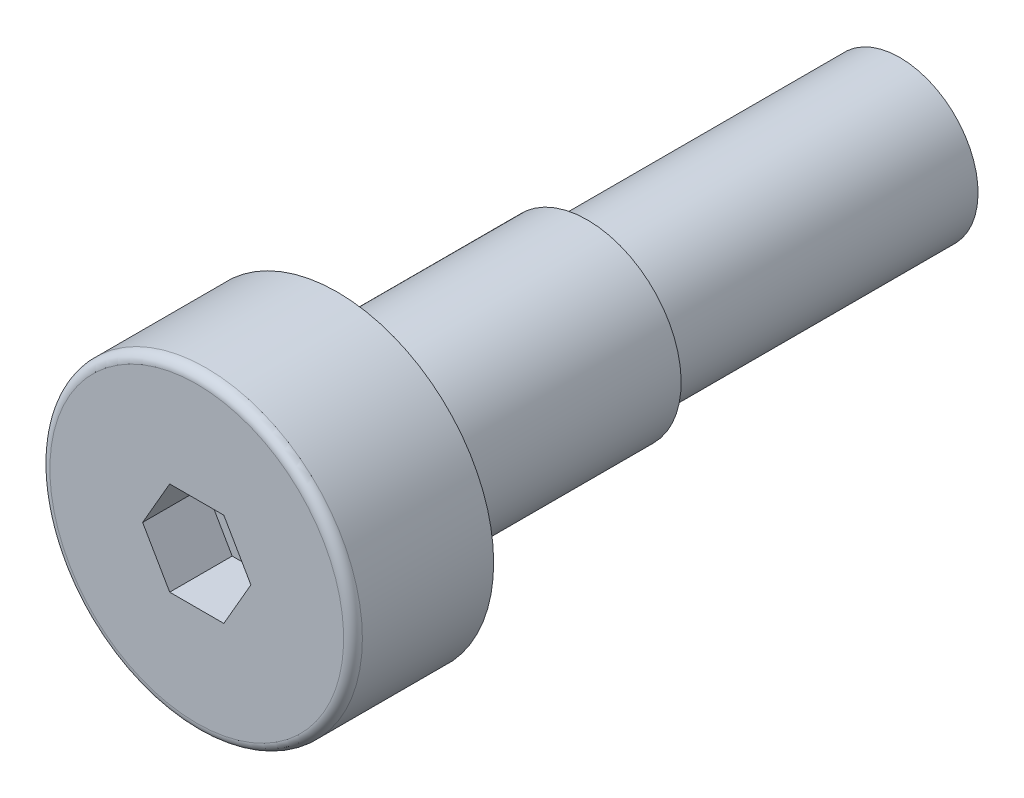
ISO-10303-21;
HEADER;
FILE_DESCRIPTION(('STEP AP214'),'2;1');
FILE_NAME('part.step','',(''),(''),'','','');
FILE_SCHEMA(('AUTOMOTIVE_DESIGN { 1 0 10303 214 1 1 1 1 }'));
ENDSEC;
DATA;
#1=APPLICATION_CONTEXT('core data for automotive mechanical design processes');
#2=APPLICATION_PROTOCOL_DEFINITION('international standard','automotive_design',2000,#1);
#3=PRODUCT_CONTEXT('',#1,'mechanical');
#4=PRODUCT('Part','Part','',(#3));
#5=PRODUCT_RELATED_PRODUCT_CATEGORY('part','',(#4));
#6=PRODUCT_DEFINITION_FORMATION('','',#4);
#7=PRODUCT_DEFINITION_CONTEXT('part definition',#1,'design');
#8=PRODUCT_DEFINITION('design','',#6,#7);
#9=PRODUCT_DEFINITION_SHAPE('','',#8);
#10=(LENGTH_UNIT() NAMED_UNIT(*) SI_UNIT(.MILLI.,.METRE.));
#11=(NAMED_UNIT(*) PLANE_ANGLE_UNIT() SI_UNIT($,.RADIAN.));
#12=(NAMED_UNIT(*) SI_UNIT($,.STERADIAN.) SOLID_ANGLE_UNIT());
#13=UNCERTAINTY_MEASURE_WITH_UNIT(LENGTH_MEASURE(1.E-05),#10,'distance_accuracy_value','');
#14=(GEOMETRIC_REPRESENTATION_CONTEXT(3) GLOBAL_UNCERTAINTY_ASSIGNED_CONTEXT((#13)) GLOBAL_UNIT_ASSIGNED_CONTEXT((#10,
#11,#12)) REPRESENTATION_CONTEXT('',''));
#15=CARTESIAN_POINT('',(0.,0.,0.));
#16=DIRECTION('',(0.,0.,1.));
#17=DIRECTION('',(1.,0.,0.));
#18=AXIS2_PLACEMENT_3D('',#15,#16,#17);
#19=CARTESIAN_POINT('',(0.,0.,0.));
#20=DIRECTION('',(0.,0.,1.));
#21=DIRECTION('',(0.,-1.,0.));
#22=AXIS2_PLACEMENT_3D('',#19,#20,#21);
#23=PLANE('',#22);
#24=CARTESIAN_POINT('',(0.,0.,0.));
#25=DIRECTION('',(0.,0.,1.));
#26=DIRECTION('',(0.,-1.,0.));
#27=AXIS2_PLACEMENT_3D('',#24,#25,#26);
#28=CIRCLE('',#27,4.7);
#29=CARTESIAN_POINT('',(0.,-4.7,0.));
#30=VERTEX_POINT('',#29);
#31=EDGE_CURVE('E11',#30,#30,#28,.T.);
#32=ORIENTED_EDGE('',*,*,#31,.T.);
#33=EDGE_LOOP('',(#32));
#34=FACE_BOUND('',#33,.T.);
#35=DIRECTION('',(-0.5,0.866025403784438,0.));
#36=VECTOR('',#35,1.);
#37=CARTESIAN_POINT('',(1.73205080756888,0.,0.));
#38=LINE('',#37,#36);
#39=CARTESIAN_POINT('',(1.73205080756888,0.,0.));
#40=VERTEX_POINT('',#39);
#41=CARTESIAN_POINT('',(0.866025403784439,1.5,0.));
#42=VERTEX_POINT('',#41);
#43=EDGE_CURVE('E60',#40,#42,#38,.T.);
#44=ORIENTED_EDGE('',*,*,#43,.F.);
#45=DIRECTION('',(0.5,0.866025403784439,0.));
#46=VECTOR('',#45,1.);
#47=CARTESIAN_POINT('',(0.866025403784438,-1.5,0.));
#48=LINE('',#47,#46);
#49=CARTESIAN_POINT('',(0.866025403784438,-1.5,0.));
#50=VERTEX_POINT('',#49);
#51=EDGE_CURVE('E155',#50,#40,#48,.T.);
#52=ORIENTED_EDGE('',*,*,#51,.F.);
#53=DIRECTION('',(1.,0.,0.));
#54=VECTOR('',#53,1.);
#55=CARTESIAN_POINT('',(-0.866025403784438,-1.5,0.));
#56=LINE('',#55,#54);
#57=CARTESIAN_POINT('',(-0.866025403784438,-1.5,0.));
#58=VERTEX_POINT('',#57);
#59=EDGE_CURVE('E152',#58,#50,#56,.T.);
#60=ORIENTED_EDGE('',*,*,#59,.F.);
#61=DIRECTION('',(0.5,-0.866025403784438,0.));
#62=VECTOR('',#61,1.);
#63=CARTESIAN_POINT('',(-1.73205080756888,0.,0.));
#64=LINE('',#63,#62);
#65=CARTESIAN_POINT('',(-1.73205080756888,0.,0.));
#66=VERTEX_POINT('',#65);
#67=EDGE_CURVE('E108',#66,#58,#64,.T.);
#68=ORIENTED_EDGE('',*,*,#67,.F.);
#69=DIRECTION('',(-0.5,-0.866025403784438,0.));
#70=VECTOR('',#69,1.);
#71=CARTESIAN_POINT('',(-0.866025403784439,1.5,0.));
#72=LINE('',#71,#70);
#73=CARTESIAN_POINT('',(-0.866025403784439,1.5,0.));
#74=VERTEX_POINT('',#73);
#75=EDGE_CURVE('E146',#74,#66,#72,.T.);
#76=ORIENTED_EDGE('',*,*,#75,.F.);
#77=DIRECTION('',(-1.,0.,0.));
#78=VECTOR('',#77,1.);
#79=CARTESIAN_POINT('',(0.866025403784439,1.5,0.));
#80=LINE('',#79,#78);
#81=EDGE_CURVE('E142',#42,#74,#80,.T.);
#82=ORIENTED_EDGE('',*,*,#81,.F.);
#83=EDGE_LOOP('',(#44,#52,#60,#68,#76,#82));
#84=FACE_BOUND('',#83,.T.);
#85=ADVANCED_FACE('F44',(#34,#84),#23,.T.);
#86=CARTESIAN_POINT('',(0.,0.,-22.5));
#87=DIRECTION('',(0.,0.,-1.));
#88=DIRECTION('',(0.,1.,0.));
#89=AXIS2_PLACEMENT_3D('',#86,#87,#88);
#90=CYLINDRICAL_SURFACE('',#89,5.);
#91=CARTESIAN_POINT('',(0.,0.,-0.299999999999998));
#92=DIRECTION('',(0.,0.,1.));
#93=DIRECTION('',(0.,-1.,0.));
#94=AXIS2_PLACEMENT_3D('',#91,#92,#93);
#95=CIRCLE('',#94,5.);
#96=CARTESIAN_POINT('',(0.,-5.,-0.299999999999997));
#97=VERTEX_POINT('',#96);
#98=EDGE_CURVE('E53',#97,#97,#95,.F.);
#99=ORIENTED_EDGE('',*,*,#98,.T.);
#100=EDGE_LOOP('',(#99));
#101=FACE_BOUND('',#100,.T.);
#102=CARTESIAN_POINT('',(0.,0.,-4.5));
#103=DIRECTION('',(0.,0.,-1.));
#104=DIRECTION('',(0.,1.,0.));
#105=AXIS2_PLACEMENT_3D('',#102,#103,#104);
#106=CIRCLE('',#105,5.);
#107=CARTESIAN_POINT('',(0.,5.,-4.5));
#108=VERTEX_POINT('',#107);
#109=EDGE_CURVE('E184',#108,#108,#106,.T.);
#110=ORIENTED_EDGE('',*,*,#109,.F.);
#111=EDGE_LOOP('',(#110));
#112=FACE_BOUND('',#111,.T.);
#113=ADVANCED_FACE('F192',(#101,#112),#90,.T.);
#114=CARTESIAN_POINT('',(0.,5.,-4.5));
#115=DIRECTION('',(0.,0.,-1.));
#116=DIRECTION('',(0.,1.,0.));
#117=AXIS2_PLACEMENT_3D('',#114,#115,#116);
#118=PLANE('',#117);
#119=ORIENTED_EDGE('',*,*,#109,.T.);
#120=EDGE_LOOP('',(#119));
#121=FACE_BOUND('',#120,.T.);
#122=CARTESIAN_POINT('',(0.,0.,-4.5));
#123=DIRECTION('',(0.,0.,-1.));
#124=DIRECTION('',(0.,1.,0.));
#125=AXIS2_PLACEMENT_3D('',#122,#123,#124);
#126=CIRCLE('',#125,3.);
#127=CARTESIAN_POINT('',(0.,3.,-4.5));
#128=VERTEX_POINT('',#127);
#129=EDGE_CURVE('E180',#128,#128,#126,.T.);
#130=ORIENTED_EDGE('',*,*,#129,.F.);
#131=EDGE_LOOP('',(#130));
#132=FACE_BOUND('',#131,.T.);
#133=ADVANCED_FACE('F208',(#121,#132),#118,.T.);
#134=CARTESIAN_POINT('',(0.,0.,-22.5));
#135=DIRECTION('',(0.,0.,-1.));
#136=DIRECTION('',(0.,1.,0.));
#137=AXIS2_PLACEMENT_3D('',#134,#135,#136);
#138=CYLINDRICAL_SURFACE('',#137,3.);
#139=ORIENTED_EDGE('',*,*,#129,.T.);
#140=EDGE_LOOP('',(#139));
#141=FACE_BOUND('',#140,.T.);
#142=CARTESIAN_POINT('',(0.,0.,-12.5));
#143=DIRECTION('',(0.,0.,-1.));
#144=DIRECTION('',(0.,1.,0.));
#145=AXIS2_PLACEMENT_3D('',#142,#143,#144);
#146=CIRCLE('',#145,2.99999999999999);
#147=CARTESIAN_POINT('',(0.,2.99999999999999,-12.5));
#148=VERTEX_POINT('',#147);
#149=EDGE_CURVE('E176',#148,#148,#146,.T.);
#150=ORIENTED_EDGE('',*,*,#149,.F.);
#151=EDGE_LOOP('',(#150));
#152=FACE_BOUND('',#151,.T.);
#153=ADVANCED_FACE('F214',(#141,#152),#138,.T.);
#154=CARTESIAN_POINT('',(0.,2.99999999999999,-12.5));
#155=DIRECTION('',(0.,0.,-1.));
#156=DIRECTION('',(0.,1.,0.));
#157=AXIS2_PLACEMENT_3D('',#154,#155,#156);
#158=PLANE('',#157);
#159=ORIENTED_EDGE('',*,*,#149,.T.);
#160=EDGE_LOOP('',(#159));
#161=FACE_BOUND('',#160,.T.);
#162=CARTESIAN_POINT('',(0.,0.,-12.5));
#163=DIRECTION('',(0.,0.,-1.));
#164=DIRECTION('',(0.,1.,0.));
#165=AXIS2_PLACEMENT_3D('',#162,#163,#164);
#166=CIRCLE('',#165,2.5);
#167=CARTESIAN_POINT('',(0.,2.5,-12.5));
#168=VERTEX_POINT('',#167);
#169=EDGE_CURVE('E172',#168,#168,#166,.T.);
#170=ORIENTED_EDGE('',*,*,#169,.F.);
#171=EDGE_LOOP('',(#170));
#172=FACE_BOUND('',#171,.T.);
#173=ADVANCED_FACE('F218',(#161,#172),#158,.T.);
#174=CARTESIAN_POINT('',(0.,0.,-22.5));
#175=DIRECTION('',(0.,0.,-1.));
#176=DIRECTION('',(0.,1.,0.));
#177=AXIS2_PLACEMENT_3D('',#174,#175,#176);
#178=CYLINDRICAL_SURFACE('',#177,2.5);
#179=ORIENTED_EDGE('',*,*,#169,.T.);
#180=EDGE_LOOP('',(#179));
#181=FACE_BOUND('',#180,.T.);
#182=CARTESIAN_POINT('',(0.,0.,-22.5));
#183=DIRECTION('',(0.,0.,-1.));
#184=DIRECTION('',(0.,1.,0.));
#185=AXIS2_PLACEMENT_3D('',#182,#183,#184);
#186=CIRCLE('',#185,2.5);
#187=CARTESIAN_POINT('',(0.,2.5,-22.5));
#188=VERTEX_POINT('',#187);
#189=EDGE_CURVE('E160',#188,#188,#186,.T.);
#190=ORIENTED_EDGE('',*,*,#189,.F.);
#191=EDGE_LOOP('',(#190));
#192=FACE_BOUND('',#191,.T.);
#193=ADVANCED_FACE('F222',(#181,#192),#178,.T.);
#194=CARTESIAN_POINT('',(0.,2.5,-22.5));
#195=DIRECTION('',(0.,0.,-1.));
#196=DIRECTION('',(0.,1.,0.));
#197=AXIS2_PLACEMENT_3D('',#194,#195,#196);
#198=PLANE('',#197);
#199=ORIENTED_EDGE('',*,*,#189,.T.);
#200=EDGE_LOOP('',(#199));
#201=FACE_BOUND('',#200,.T.);
#202=ADVANCED_FACE('F226',(#201),#198,.T.);
#203=CARTESIAN_POINT('',(1.73205080756888,0.,-2.));
#204=DIRECTION('',(0.866025403784438,0.5,0.));
#205=DIRECTION('',(-0.5,0.866025403784439,0.));
#206=AXIS2_PLACEMENT_3D('',#203,#204,#205);
#207=PLANE('',#206);
#208=ORIENTED_EDGE('',*,*,#43,.T.);
#209=DIRECTION('',(0.,0.,1.));
#210=VECTOR('',#209,1.);
#211=CARTESIAN_POINT('',(0.866025403784439,1.5,-2.));
#212=LINE('',#211,#210);
#213=CARTESIAN_POINT('',(0.866025403784439,1.5,-2.));
#214=VERTEX_POINT('',#213);
#215=EDGE_CURVE('E90',#214,#42,#212,.T.);
#216=ORIENTED_EDGE('',*,*,#215,.F.);
#217=DIRECTION('',(-0.5,0.866025403784438,0.));
#218=VECTOR('',#217,1.);
#219=CARTESIAN_POINT('',(1.73205080756888,0.,-2.));
#220=LINE('',#219,#218);
#221=CARTESIAN_POINT('',(1.73205080756888,0.,-2.));
#222=VERTEX_POINT('',#221);
#223=EDGE_CURVE('E157',#222,#214,#220,.T.);
#224=ORIENTED_EDGE('',*,*,#223,.F.);
#225=DIRECTION('',(0.,0.,1.));
#226=VECTOR('',#225,1.);
#227=CARTESIAN_POINT('',(1.73205080756888,0.,-2.));
#228=LINE('',#227,#226);
#229=EDGE_CURVE('E68',#222,#40,#228,.T.);
#230=ORIENTED_EDGE('',*,*,#229,.T.);
#231=EDGE_LOOP('',(#208,#216,#224,#230));
#232=FACE_BOUND('',#231,.T.);
#233=ADVANCED_FACE('F230',(#232),#207,.F.);
#234=CARTESIAN_POINT('',(0.866025403784438,-1.5,-2.));
#235=DIRECTION('',(0.866025403784439,-0.5,0.));
#236=DIRECTION('',(0.5,0.866025403784439,0.));
#237=AXIS2_PLACEMENT_3D('',#234,#235,#236);
#238=PLANE('',#237);
#239=ORIENTED_EDGE('',*,*,#51,.T.);
#240=ORIENTED_EDGE('',*,*,#229,.F.);
#241=DIRECTION('',(0.5,0.866025403784439,0.));
#242=VECTOR('',#241,1.);
#243=CARTESIAN_POINT('',(0.866025403784438,-1.5,-2.));
#244=LINE('',#243,#242);
#245=CARTESIAN_POINT('',(0.866025403784438,-1.5,-2.));
#246=VERTEX_POINT('',#245);
#247=EDGE_CURVE('E122',#246,#222,#244,.T.);
#248=ORIENTED_EDGE('',*,*,#247,.F.);
#249=DIRECTION('',(0.,0.,1.));
#250=VECTOR('',#249,1.);
#251=CARTESIAN_POINT('',(0.866025403784438,-1.5,-2.));
#252=LINE('',#251,#250);
#253=EDGE_CURVE('E113',#246,#50,#252,.T.);
#254=ORIENTED_EDGE('',*,*,#253,.T.);
#255=EDGE_LOOP('',(#239,#240,#248,#254));
#256=FACE_BOUND('',#255,.T.);
#257=ADVANCED_FACE('F234',(#256),#238,.F.);
#258=CARTESIAN_POINT('',(-0.866025403784438,-1.5,-2.));
#259=DIRECTION('',(0.,-1.,0.));
#260=DIRECTION('',(0.,0.,-1.));
#261=AXIS2_PLACEMENT_3D('',#258,#259,#260);
#262=PLANE('',#261);
#263=ORIENTED_EDGE('',*,*,#59,.T.);
#264=ORIENTED_EDGE('',*,*,#253,.F.);
#265=DIRECTION('',(1.,0.,0.));
#266=VECTOR('',#265,1.);
#267=CARTESIAN_POINT('',(-0.866025403784438,-1.5,-2.));
#268=LINE('',#267,#266);
#269=CARTESIAN_POINT('',(-0.866025403784438,-1.5,-2.));
#270=VERTEX_POINT('',#269);
#271=EDGE_CURVE('E117',#270,#246,#268,.T.);
#272=ORIENTED_EDGE('',*,*,#271,.F.);
#273=DIRECTION('',(0.,0.,1.));
#274=VECTOR('',#273,1.);
#275=CARTESIAN_POINT('',(-0.866025403784438,-1.5,-2.));
#276=LINE('',#275,#274);
#277=EDGE_CURVE('E101',#270,#58,#276,.T.);
#278=ORIENTED_EDGE('',*,*,#277,.T.);
#279=EDGE_LOOP('',(#263,#264,#272,#278));
#280=FACE_BOUND('',#279,.T.);
#281=ADVANCED_FACE('F118',(#280),#262,.F.);
#282=CARTESIAN_POINT('',(-1.73205080756888,0.,-2.));
#283=DIRECTION('',(-0.866025403784438,-0.5,0.));
#284=DIRECTION('',(0.5,-0.866025403784439,0.));
#285=AXIS2_PLACEMENT_3D('',#282,#283,#284);
#286=PLANE('',#285);
#287=ORIENTED_EDGE('',*,*,#67,.T.);
#288=ORIENTED_EDGE('',*,*,#277,.F.);
#289=DIRECTION('',(0.5,-0.866025403784438,0.));
#290=VECTOR('',#289,1.);
#291=CARTESIAN_POINT('',(-1.73205080756888,0.,-2.));
#292=LINE('',#291,#290);
#293=CARTESIAN_POINT('',(-1.73205080756888,0.,-2.));
#294=VERTEX_POINT('',#293);
#295=EDGE_CURVE('E105',#294,#270,#292,.T.);
#296=ORIENTED_EDGE('',*,*,#295,.F.);
#297=DIRECTION('',(0.,0.,1.));
#298=VECTOR('',#297,1.);
#299=CARTESIAN_POINT('',(-1.73205080756888,0.,-2.));
#300=LINE('',#299,#298);
#301=EDGE_CURVE('E114',#294,#66,#300,.T.);
#302=ORIENTED_EDGE('',*,*,#301,.T.);
#303=EDGE_LOOP('',(#287,#288,#296,#302));
#304=FACE_BOUND('',#303,.T.);
#305=ADVANCED_FACE('F103',(#304),#286,.F.);
#306=CARTESIAN_POINT('',(-0.866025403784439,1.5,-2.));
#307=DIRECTION('',(-0.866025403784439,0.5,0.));
#308=DIRECTION('',(-0.5,-0.866025403784438,0.));
#309=AXIS2_PLACEMENT_3D('',#306,#307,#308);
#310=PLANE('',#309);
#311=ORIENTED_EDGE('',*,*,#75,.T.);
#312=ORIENTED_EDGE('',*,*,#301,.F.);
#313=DIRECTION('',(-0.5,-0.866025403784438,0.));
#314=VECTOR('',#313,1.);
#315=CARTESIAN_POINT('',(-0.866025403784439,1.5,-2.));
#316=LINE('',#315,#314);
#317=CARTESIAN_POINT('',(-0.866025403784439,1.5,-2.));
#318=VERTEX_POINT('',#317);
#319=EDGE_CURVE('E128',#318,#294,#316,.T.);
#320=ORIENTED_EDGE('',*,*,#319,.F.);
#321=DIRECTION('',(0.,0.,1.));
#322=VECTOR('',#321,1.);
#323=CARTESIAN_POINT('',(-0.866025403784439,1.5,-2.));
#324=LINE('',#323,#322);
#325=EDGE_CURVE('E164',#318,#74,#324,.T.);
#326=ORIENTED_EDGE('',*,*,#325,.T.);
#327=EDGE_LOOP('',(#311,#312,#320,#326));
#328=FACE_BOUND('',#327,.T.);
#329=ADVANCED_FACE('F237',(#328),#310,.F.);
#330=CARTESIAN_POINT('',(0.866025403784439,1.5,-2.));
#331=DIRECTION('',(0.,1.,0.));
#332=DIRECTION('',(-1.,0.,0.));
#333=AXIS2_PLACEMENT_3D('',#330,#331,#332);
#334=PLANE('',#333);
#335=ORIENTED_EDGE('',*,*,#81,.T.);
#336=ORIENTED_EDGE('',*,*,#325,.F.);
#337=DIRECTION('',(-1.,0.,0.));
#338=VECTOR('',#337,1.);
#339=CARTESIAN_POINT('',(0.866025403784439,1.5,-2.));
#340=LINE('',#339,#338);
#341=EDGE_CURVE('E134',#214,#318,#340,.T.);
#342=ORIENTED_EDGE('',*,*,#341,.F.);
#343=ORIENTED_EDGE('',*,*,#215,.T.);
#344=EDGE_LOOP('',(#335,#336,#342,#343));
#345=FACE_BOUND('',#344,.T.);
#346=ADVANCED_FACE('F200',(#345),#334,.F.);
#347=CARTESIAN_POINT('',(0.,0.,-2.));
#348=DIRECTION('',(0.,0.,1.));
#349=DIRECTION('',(1.,0.,0.));
#350=AXIS2_PLACEMENT_3D('',#347,#348,#349);
#351=PLANE('',#350);
#352=ORIENTED_EDGE('',*,*,#223,.T.);
#353=ORIENTED_EDGE('',*,*,#341,.T.);
#354=ORIENTED_EDGE('',*,*,#319,.T.);
#355=ORIENTED_EDGE('',*,*,#295,.T.);
#356=ORIENTED_EDGE('',*,*,#271,.T.);
#357=ORIENTED_EDGE('',*,*,#247,.T.);
#358=EDGE_LOOP('',(#352,#353,#354,#355,#356,#357));
#359=FACE_BOUND('',#358,.T.);
#360=ADVANCED_FACE('F125',(#359),#351,.T.);
#361=CARTESIAN_POINT('',(0.,0.,-0.299999999999998));
#362=DIRECTION('',(0.,0.,1.));
#363=DIRECTION('',(0.,-1.,0.));
#364=AXIS2_PLACEMENT_3D('',#361,#362,#363);
#365=TOROIDAL_SURFACE('',#364,4.7,0.3);
#366=ORIENTED_EDGE('',*,*,#31,.F.);
#367=EDGE_LOOP('',(#366));
#368=FACE_BOUND('',#367,.T.);
#369=ORIENTED_EDGE('',*,*,#98,.F.);
#370=EDGE_LOOP('',(#369));
#371=FACE_BOUND('',#370,.T.);
#372=ADVANCED_FACE('F46',(#368,#371),#365,.T.);
#373=CLOSED_SHELL('',(#85,#113,#133,#153,#173,#193,#202,#233,#257,#281,#305,#329,#346,#360,#372));
#374=MANIFOLD_SOLID_BREP('B2',#373);
#375=ADVANCED_BREP_SHAPE_REPRESENTATION('',(#18,#374),#14);
#376=SHAPE_DEFINITION_REPRESENTATION(#9,#375);
ENDSEC;
END-ISO-10303-21;
